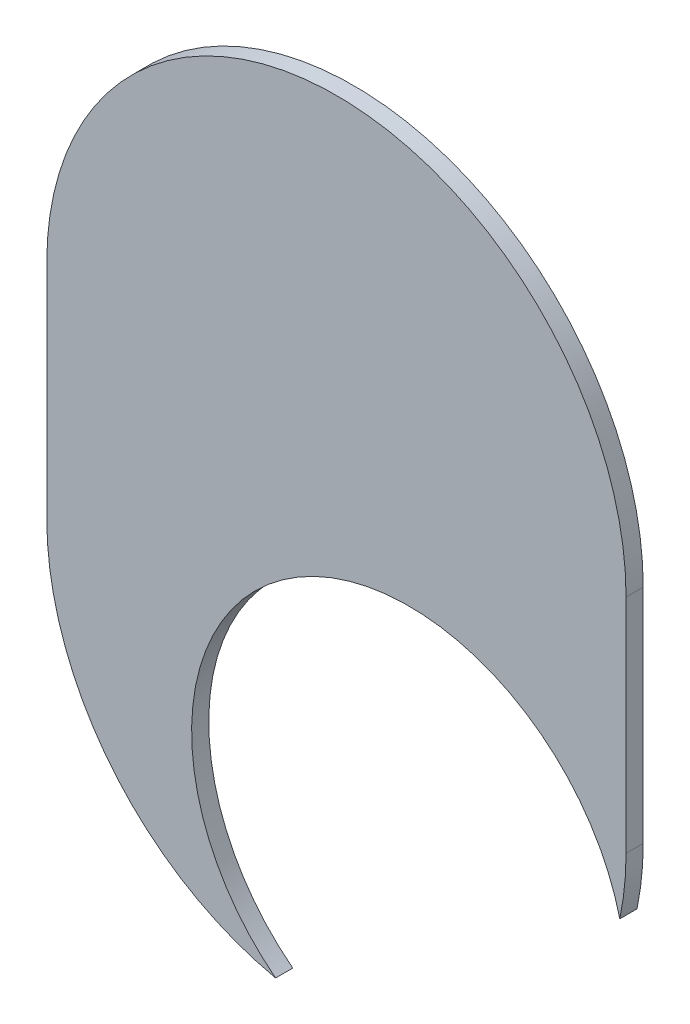
ISO-10303-21;
HEADER;
FILE_DESCRIPTION(('STEP AP214'),'2;1');
FILE_NAME('part.step','',(''),(''),'','','');
FILE_SCHEMA(('AUTOMOTIVE_DESIGN { 1 0 10303 214 1 1 1 1 }'));
ENDSEC;
DATA;
#1=APPLICATION_CONTEXT('core data for automotive mechanical design processes');
#2=APPLICATION_PROTOCOL_DEFINITION('international standard','automotive_design',2000,#1);
#3=PRODUCT_CONTEXT('',#1,'mechanical');
#4=PRODUCT('Part','Part','',(#3));
#5=PRODUCT_RELATED_PRODUCT_CATEGORY('part','',(#4));
#6=PRODUCT_DEFINITION_FORMATION('','',#4);
#7=PRODUCT_DEFINITION_CONTEXT('part definition',#1,'design');
#8=PRODUCT_DEFINITION('design','',#6,#7);
#9=PRODUCT_DEFINITION_SHAPE('','',#8);
#10=(LENGTH_UNIT() NAMED_UNIT(*) SI_UNIT(.MILLI.,.METRE.));
#11=(NAMED_UNIT(*) PLANE_ANGLE_UNIT() SI_UNIT($,.RADIAN.));
#12=(NAMED_UNIT(*) SI_UNIT($,.STERADIAN.) SOLID_ANGLE_UNIT());
#13=UNCERTAINTY_MEASURE_WITH_UNIT(LENGTH_MEASURE(1.E-05),#10,'distance_accuracy_value','');
#14=(GEOMETRIC_REPRESENTATION_CONTEXT(3) GLOBAL_UNCERTAINTY_ASSIGNED_CONTEXT((#13)) GLOBAL_UNIT_ASSIGNED_CONTEXT((#10,
#11,#12)) REPRESENTATION_CONTEXT('',''));
#15=CARTESIAN_POINT('',(0.,0.,0.));
#16=DIRECTION('',(0.,0.,1.));
#17=DIRECTION('',(1.,0.,0.));
#18=AXIS2_PLACEMENT_3D('',#15,#16,#17);
#19=CARTESIAN_POINT('',(94.28099,117.2592016,0.));
#20=DIRECTION('',(-1.,0.,0.));
#21=DIRECTION('',(0.,1.,0.));
#22=AXIS2_PLACEMENT_3D('',#19,#20,#21);
#23=PLANE('',#22);
#24=DIRECTION('',(0.,1.,0.));
#25=VECTOR('',#24,1.);
#26=CARTESIAN_POINT('',(94.28099,117.2592016,0.03556));
#27=LINE('',#26,#25);
#28=CARTESIAN_POINT('',(94.28099,117.2592016,0.03556));
#29=VERTEX_POINT('',#28);
#30=CARTESIAN_POINT('',(94.28099,117.7189924,0.03556));
#31=VERTEX_POINT('',#30);
#32=EDGE_CURVE('E11',#29,#31,#27,.T.);
#33=ORIENTED_EDGE('',*,*,#32,.F.);
#34=DIRECTION('',(0.,0.,1.));
#35=VECTOR('',#34,1.);
#36=CARTESIAN_POINT('',(94.28099,117.2592016,0.));
#37=LINE('',#36,#35);
#38=CARTESIAN_POINT('',(94.28099,117.2592016,0.));
#39=VERTEX_POINT('',#38);
#40=EDGE_CURVE('E24',#39,#29,#37,.T.);
#41=ORIENTED_EDGE('',*,*,#40,.F.);
#42=DIRECTION('',(0.,1.,0.));
#43=VECTOR('',#42,1.);
#44=CARTESIAN_POINT('',(94.28099,117.2592016,0.));
#45=LINE('',#44,#43);
#46=CARTESIAN_POINT('',(94.28099,117.7189924,0.));
#47=VERTEX_POINT('',#46);
#48=EDGE_CURVE('E88',#39,#47,#45,.T.);
#49=ORIENTED_EDGE('',*,*,#48,.T.);
#50=DIRECTION('',(0.,0.,1.));
#51=VECTOR('',#50,1.);
#52=CARTESIAN_POINT('',(94.28099,117.7189924,0.));
#53=LINE('',#52,#51);
#54=EDGE_CURVE('E37',#47,#31,#53,.T.);
#55=ORIENTED_EDGE('',*,*,#54,.T.);
#56=EDGE_LOOP('',(#33,#41,#49,#55));
#57=FACE_BOUND('',#56,.T.);
#58=ADVANCED_FACE('F17',(#57),#23,.F.);
#59=CARTESIAN_POINT('',(93.6809912,117.7189924,0.));
#60=DIRECTION('',(0.,0.,-1.));
#61=DIRECTION('',(1.,0.,0.));
#62=AXIS2_PLACEMENT_3D('',#59,#60,#61);
#63=CYLINDRICAL_SURFACE('',#62,0.599998799999995);
#64=CARTESIAN_POINT('',(93.6809912,117.7189924,0.03556));
#65=DIRECTION('',(0.,0.,1.));
#66=DIRECTION('',(1.,0.,0.));
#67=AXIS2_PLACEMENT_3D('',#64,#65,#66);
#68=CIRCLE('',#67,0.599998799999995);
#69=CARTESIAN_POINT('',(93.0809924,117.7189924,0.03556));
#70=VERTEX_POINT('',#69);
#71=EDGE_CURVE('E121',#31,#70,#68,.T.);
#72=ORIENTED_EDGE('',*,*,#71,.F.);
#73=ORIENTED_EDGE('',*,*,#54,.F.);
#74=CARTESIAN_POINT('',(93.6809912,117.7189924,0.));
#75=DIRECTION('',(0.,0.,1.));
#76=DIRECTION('',(1.,0.,0.));
#77=AXIS2_PLACEMENT_3D('',#74,#75,#76);
#78=CIRCLE('',#77,0.599998799999995);
#79=CARTESIAN_POINT('',(93.0809924,117.7189924,0.));
#80=VERTEX_POINT('',#79);
#81=EDGE_CURVE('E119',#47,#80,#78,.T.);
#82=ORIENTED_EDGE('',*,*,#81,.T.);
#83=DIRECTION('',(0.,0.,1.));
#84=VECTOR('',#83,1.);
#85=CARTESIAN_POINT('',(93.0809924,117.7189924,0.));
#86=LINE('',#85,#84);
#87=EDGE_CURVE('E113',#80,#70,#86,.T.);
#88=ORIENTED_EDGE('',*,*,#87,.T.);
#89=EDGE_LOOP('',(#72,#73,#82,#88));
#90=FACE_BOUND('',#89,.T.);
#91=ADVANCED_FACE('F126',(#90),#63,.T.);
#92=CARTESIAN_POINT('',(93.0809924,117.7189924,0.));
#93=DIRECTION('',(1.,0.,0.));
#94=DIRECTION('',(0.,-1.,0.));
#95=AXIS2_PLACEMENT_3D('',#92,#93,#94);
#96=PLANE('',#95);
#97=DIRECTION('',(0.,-1.,0.));
#98=VECTOR('',#97,1.);
#99=CARTESIAN_POINT('',(93.0809924,117.7189924,0.03556));
#100=LINE('',#99,#98);
#101=CARTESIAN_POINT('',(93.0809924,117.2592016,0.03556));
#102=VERTEX_POINT('',#101);
#103=EDGE_CURVE('E105',#70,#102,#100,.T.);
#104=ORIENTED_EDGE('',*,*,#103,.F.);
#105=ORIENTED_EDGE('',*,*,#87,.F.);
#106=DIRECTION('',(0.,-1.,0.));
#107=VECTOR('',#106,1.);
#108=CARTESIAN_POINT('',(93.0809924,117.7189924,0.));
#109=LINE('',#108,#107);
#110=CARTESIAN_POINT('',(93.0809924,117.2592016,0.));
#111=VERTEX_POINT('',#110);
#112=EDGE_CURVE('E109',#80,#111,#109,.T.);
#113=ORIENTED_EDGE('',*,*,#112,.T.);
#114=DIRECTION('',(0.,0.,1.));
#115=VECTOR('',#114,1.);
#116=CARTESIAN_POINT('',(93.0809924,117.2592016,0.));
#117=LINE('',#116,#115);
#118=EDGE_CURVE('E97',#111,#102,#117,.T.);
#119=ORIENTED_EDGE('',*,*,#118,.T.);
#120=EDGE_LOOP('',(#104,#105,#113,#119));
#121=FACE_BOUND('',#120,.T.);
#122=ADVANCED_FACE('F112',(#121),#96,.F.);
#123=CARTESIAN_POINT('',(93.6809912,117.2592016,0.));
#124=DIRECTION('',(0.,0.,-1.));
#125=DIRECTION('',(-1.,0.,0.));
#126=AXIS2_PLACEMENT_3D('',#123,#124,#125);
#127=CYLINDRICAL_SURFACE('',#126,0.59999879999999);
#128=CARTESIAN_POINT('',(93.6809912,117.2592016,0.03556));
#129=DIRECTION('',(0.,0.,1.));
#130=DIRECTION('',(-1.,0.,0.));
#131=AXIS2_PLACEMENT_3D('',#128,#129,#130);
#132=CIRCLE('',#131,0.59999879999999);
#133=CARTESIAN_POINT('',(93.5550244805516,116.672574848485,0.03556));
#134=VERTEX_POINT('',#133);
#135=EDGE_CURVE('E94',#102,#134,#132,.T.);
#136=ORIENTED_EDGE('',*,*,#135,.F.);
#137=ORIENTED_EDGE('',*,*,#118,.F.);
#138=CARTESIAN_POINT('',(93.6809912,117.2592016,0.));
#139=DIRECTION('',(0.,0.,1.));
#140=DIRECTION('',(-1.,0.,0.));
#141=AXIS2_PLACEMENT_3D('',#138,#139,#140);
#142=CIRCLE('',#141,0.59999879999999);
#143=CARTESIAN_POINT('',(93.5550244805516,116.672574848485,0.));
#144=VERTEX_POINT('',#143);
#145=EDGE_CURVE('E90',#111,#144,#142,.T.);
#146=ORIENTED_EDGE('',*,*,#145,.T.);
#147=DIRECTION('',(0.,0.,1.));
#148=VECTOR('',#147,1.);
#149=CARTESIAN_POINT('',(93.5550244805516,116.672574848485,0.));
#150=LINE('',#149,#148);
#151=EDGE_CURVE('E75',#144,#134,#150,.T.);
#152=ORIENTED_EDGE('',*,*,#151,.T.);
#153=EDGE_LOOP('',(#136,#137,#146,#152));
#154=FACE_BOUND('',#153,.T.);
#155=ADVANCED_FACE('F106',(#154),#127,.T.);
#156=CARTESIAN_POINT('',(93.8310036,117.0280108,0.));
#157=DIRECTION('',(0.,0.,-1.));
#158=DIRECTION('',(1.,0.,0.));
#159=AXIS2_PLACEMENT_3D('',#156,#157,#158);
#160=CYLINDRICAL_SURFACE('',#159,0.4499991);
#161=DIRECTION('',(0.,0.,1.));
#162=VECTOR('',#161,1.);
#163=CARTESIAN_POINT('',(94.2680427943188,117.13522988706,0.));
#164=LINE('',#163,#162);
#165=CARTESIAN_POINT('',(94.2680427943188,117.13522988706,0.));
#166=VERTEX_POINT('',#165);
#167=CARTESIAN_POINT('',(94.2680427943188,117.13522988706,0.03556));
#168=VERTEX_POINT('',#167);
#169=EDGE_CURVE('E65',#166,#168,#164,.T.);
#170=ORIENTED_EDGE('',*,*,#169,.T.);
#171=CARTESIAN_POINT('',(93.8310036,117.0280108,0.03556));
#172=DIRECTION('',(0.,0.,1.));
#173=DIRECTION('',(1.,0.,0.));
#174=AXIS2_PLACEMENT_3D('',#171,#172,#173);
#175=CIRCLE('',#174,0.4499991);
#176=EDGE_CURVE('E76',#168,#134,#175,.T.);
#177=ORIENTED_EDGE('',*,*,#176,.T.);
#178=ORIENTED_EDGE('',*,*,#151,.F.);
#179=CARTESIAN_POINT('',(93.8310036,117.0280108,0.));
#180=DIRECTION('',(0.,0.,1.));
#181=DIRECTION('',(1.,0.,0.));
#182=AXIS2_PLACEMENT_3D('',#179,#180,#181);
#183=CIRCLE('',#182,0.4499991);
#184=EDGE_CURVE('E79',#166,#144,#183,.T.);
#185=ORIENTED_EDGE('',*,*,#184,.F.);
#186=EDGE_LOOP('',(#170,#177,#178,#185));
#187=FACE_BOUND('',#186,.T.);
#188=ADVANCED_FACE('F80',(#187),#160,.F.);
#189=CARTESIAN_POINT('',(93.6809912,117.2592016,0.));
#190=DIRECTION('',(0.,0.,-1.));
#191=DIRECTION('',(-1.,0.,0.));
#192=AXIS2_PLACEMENT_3D('',#189,#190,#191);
#193=CYLINDRICAL_SURFACE('',#192,0.59999879999999);
#194=CARTESIAN_POINT('',(93.6809912,117.2592016,0.03556));
#195=DIRECTION('',(0.,0.,1.));
#196=DIRECTION('',(-1.,0.,0.));
#197=AXIS2_PLACEMENT_3D('',#194,#195,#196);
#198=CIRCLE('',#197,0.59999879999999);
#199=EDGE_CURVE('E71',#168,#29,#198,.T.);
#200=ORIENTED_EDGE('',*,*,#199,.F.);
#201=ORIENTED_EDGE('',*,*,#169,.F.);
#202=EDGE_CURVE('E69',#166,#39,#142,.T.);
#203=ORIENTED_EDGE('',*,*,#202,.T.);
#204=ORIENTED_EDGE('',*,*,#40,.T.);
#205=EDGE_LOOP('',(#200,#201,#203,#204));
#206=FACE_BOUND('',#205,.T.);
#207=ADVANCED_FACE('F67',(#206),#193,.T.);
#208=CARTESIAN_POINT('',(94.28099,117.2592016,0.));
#209=DIRECTION('',(0.,0.,-1.));
#210=DIRECTION('',(-1.,0.,0.));
#211=AXIS2_PLACEMENT_3D('',#208,#209,#210);
#212=PLANE('',#211);
#213=ORIENTED_EDGE('',*,*,#48,.F.);
#214=ORIENTED_EDGE('',*,*,#202,.F.);
#215=ORIENTED_EDGE('',*,*,#184,.T.);
#216=ORIENTED_EDGE('',*,*,#145,.F.);
#217=ORIENTED_EDGE('',*,*,#112,.F.);
#218=ORIENTED_EDGE('',*,*,#81,.F.);
#219=EDGE_LOOP('',(#213,#214,#215,#216,#217,#218));
#220=FACE_BOUND('',#219,.T.);
#221=ADVANCED_FACE('F86',(#220),#212,.T.);
#222=CARTESIAN_POINT('',(94.28099,117.2592016,0.03556));
#223=DIRECTION('',(0.,0.,-1.));
#224=DIRECTION('',(-1.,0.,0.));
#225=AXIS2_PLACEMENT_3D('',#222,#223,#224);
#226=PLANE('',#225);
#227=ORIENTED_EDGE('',*,*,#199,.T.);
#228=ORIENTED_EDGE('',*,*,#32,.T.);
#229=ORIENTED_EDGE('',*,*,#71,.T.);
#230=ORIENTED_EDGE('',*,*,#103,.T.);
#231=ORIENTED_EDGE('',*,*,#135,.T.);
#232=ORIENTED_EDGE('',*,*,#176,.F.);
#233=EDGE_LOOP('',(#227,#228,#229,#230,#231,#232));
#234=FACE_BOUND('',#233,.T.);
#235=ADVANCED_FACE('F101',(#234),#226,.F.);
#236=CLOSED_SHELL('',(#58,#91,#122,#155,#188,#207,#221,#235));
#237=MANIFOLD_SOLID_BREP('B1',#236);
#238=ADVANCED_BREP_SHAPE_REPRESENTATION('',(#18,#237),#14);
#239=SHAPE_DEFINITION_REPRESENTATION(#9,#238);
ENDSEC;
END-ISO-10303-21;
